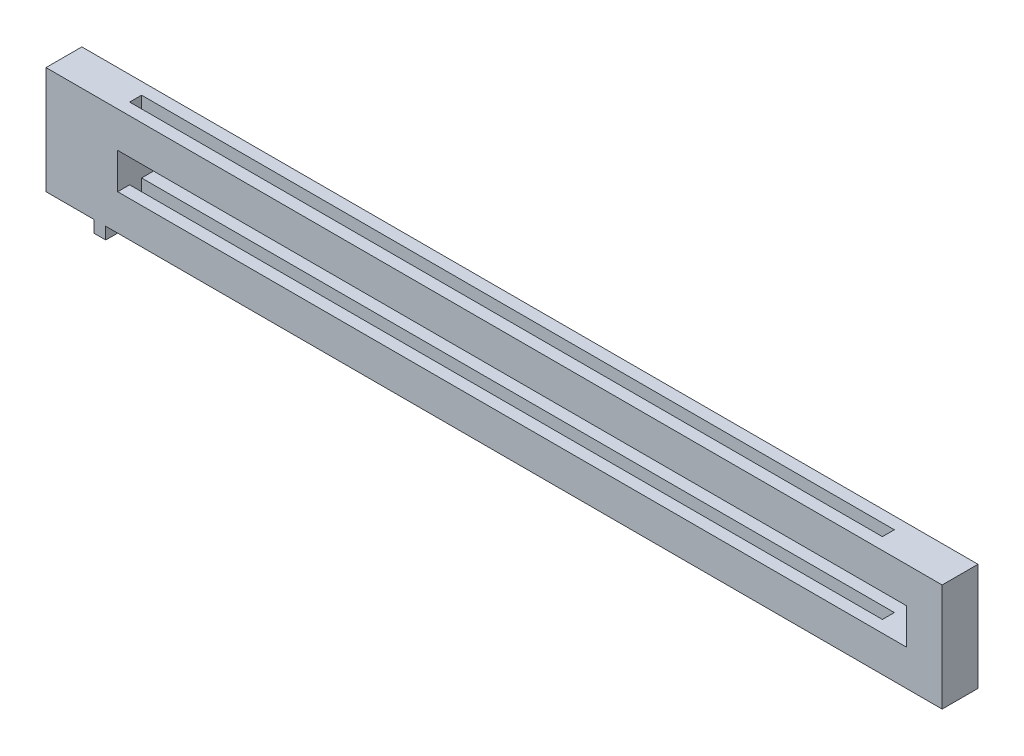
ISO-10303-21;
HEADER;
FILE_DESCRIPTION(('STEP AP214'),'2;1');
FILE_NAME('part.step','',(''),(''),'','','');
FILE_SCHEMA(('AUTOMOTIVE_DESIGN { 1 0 10303 214 1 1 1 1 }'));
ENDSEC;
DATA;
#1=APPLICATION_CONTEXT('core data for automotive mechanical design processes');
#2=APPLICATION_PROTOCOL_DEFINITION('international standard','automotive_design',2000,#1);
#3=PRODUCT_CONTEXT('',#1,'mechanical');
#4=PRODUCT('Part','Part','',(#3));
#5=PRODUCT_RELATED_PRODUCT_CATEGORY('part','',(#4));
#6=PRODUCT_DEFINITION_FORMATION('','',#4);
#7=PRODUCT_DEFINITION_CONTEXT('part definition',#1,'design');
#8=PRODUCT_DEFINITION('design','',#6,#7);
#9=PRODUCT_DEFINITION_SHAPE('','',#8);
#10=(LENGTH_UNIT() NAMED_UNIT(*) SI_UNIT(.MILLI.,.METRE.));
#11=(NAMED_UNIT(*) PLANE_ANGLE_UNIT() SI_UNIT($,.RADIAN.));
#12=(NAMED_UNIT(*) SI_UNIT($,.STERADIAN.) SOLID_ANGLE_UNIT());
#13=UNCERTAINTY_MEASURE_WITH_UNIT(LENGTH_MEASURE(1.E-05),#10,'distance_accuracy_value','');
#14=(GEOMETRIC_REPRESENTATION_CONTEXT(3) GLOBAL_UNCERTAINTY_ASSIGNED_CONTEXT((#13)) GLOBAL_UNIT_ASSIGNED_CONTEXT((#10,
#11,#12)) REPRESENTATION_CONTEXT('',''));
#15=CARTESIAN_POINT('',(0.,0.,0.));
#16=DIRECTION('',(0.,0.,1.));
#17=DIRECTION('',(1.,0.,0.));
#18=AXIS2_PLACEMENT_3D('',#15,#16,#17);
#19=CARTESIAN_POINT('',(-55.,-2.5,5.));
#20=DIRECTION('',(0.,1.,0.));
#21=DIRECTION('',(0.,0.,1.));
#22=AXIS2_PLACEMENT_3D('',#19,#20,#21);
#23=PLANE('',#22);
#24=DIRECTION('',(0.,0.,1.));
#25=VECTOR('',#24,1.);
#26=CARTESIAN_POINT('',(50.,-2.5,4.99999999999985));
#27=LINE('',#26,#25);
#28=CARTESIAN_POINT('',(50.,-2.5,1.66666666666667));
#29=VERTEX_POINT('',#28);
#30=CARTESIAN_POINT('',(50.,-2.5,3.33333333333332));
#31=VERTEX_POINT('',#30);
#32=EDGE_CURVE('E244',#29,#31,#27,.T.);
#33=ORIENTED_EDGE('',*,*,#32,.T.);
#34=DIRECTION('',(-1.,0.,0.));
#35=VECTOR('',#34,1.);
#36=CARTESIAN_POINT('',(-55.,-2.5,3.33333333333332));
#37=LINE('',#36,#35);
#38=CARTESIAN_POINT('',(-55.,-2.5,3.33333333333332));
#39=VERTEX_POINT('',#38);
#40=EDGE_CURVE('E248',#31,#39,#37,.T.);
#41=ORIENTED_EDGE('',*,*,#40,.T.);
#42=DIRECTION('',(0.,0.,-1.));
#43=VECTOR('',#42,1.);
#44=CARTESIAN_POINT('',(-55.,-2.5,5.));
#45=LINE('',#44,#43);
#46=CARTESIAN_POINT('',(-55.,-2.5,5.));
#47=VERTEX_POINT('',#46);
#48=EDGE_CURVE('E344',#47,#39,#45,.T.);
#49=ORIENTED_EDGE('',*,*,#48,.F.);
#50=DIRECTION('',(1.,0.,0.));
#51=VECTOR('',#50,1.);
#52=CARTESIAN_POINT('',(-55.,-2.5,5.));
#53=LINE('',#52,#51);
#54=CARTESIAN_POINT('',(55.,-2.5,5.));
#55=VERTEX_POINT('',#54);
#56=EDGE_CURVE('E308',#47,#55,#53,.T.);
#57=ORIENTED_EDGE('',*,*,#56,.T.);
#58=DIRECTION('',(0.,0.,-1.));
#59=VECTOR('',#58,1.);
#60=CARTESIAN_POINT('',(55.,-2.5,5.));
#61=LINE('',#60,#59);
#62=CARTESIAN_POINT('',(55.,-2.5,0.));
#63=VERTEX_POINT('',#62);
#64=EDGE_CURVE('E340',#55,#63,#61,.T.);
#65=ORIENTED_EDGE('',*,*,#64,.T.);
#66=DIRECTION('',(1.,0.,0.));
#67=VECTOR('',#66,1.);
#68=CARTESIAN_POINT('',(-55.,-2.5,0.));
#69=LINE('',#68,#67);
#70=CARTESIAN_POINT('',(-55.,-2.5,0.));
#71=VERTEX_POINT('',#70);
#72=EDGE_CURVE('E322',#71,#63,#69,.T.);
#73=ORIENTED_EDGE('',*,*,#72,.F.);
#74=CARTESIAN_POINT('',(-55.,-2.5,1.66666666666667));
#75=VERTEX_POINT('',#74);
#76=EDGE_CURVE('E343',#75,#71,#45,.T.);
#77=ORIENTED_EDGE('',*,*,#76,.F.);
#78=DIRECTION('',(-1.,0.,0.));
#79=VECTOR('',#78,1.);
#80=CARTESIAN_POINT('',(-55.,-2.5,1.66666666666667));
#81=LINE('',#80,#79);
#82=EDGE_CURVE('E233',#29,#75,#81,.T.);
#83=ORIENTED_EDGE('',*,*,#82,.F.);
#84=EDGE_LOOP('',(#33,#41,#49,#57,#65,#73,#77,#83));
#85=FACE_BOUND('',#84,.T.);
#86=ADVANCED_FACE('F46',(#85),#23,.T.);
#87=CARTESIAN_POINT('',(-55.,2.5,5.));
#88=DIRECTION('',(0.,-1.,0.));
#89=DIRECTION('',(0.,0.,-1.));
#90=AXIS2_PLACEMENT_3D('',#87,#88,#89);
#91=PLANE('',#90);
#92=DIRECTION('',(0.,0.,-1.));
#93=VECTOR('',#92,1.);
#94=CARTESIAN_POINT('',(-55.,2.5,5.));
#95=LINE('',#94,#93);
#96=CARTESIAN_POINT('',(-55.,2.5,5.));
#97=VERTEX_POINT('',#96);
#98=CARTESIAN_POINT('',(-55.,2.5,3.33333333333332));
#99=VERTEX_POINT('',#98);
#100=EDGE_CURVE('E333',#97,#99,#95,.T.);
#101=ORIENTED_EDGE('',*,*,#100,.T.);
#102=DIRECTION('',(1.,0.,0.));
#103=VECTOR('',#102,1.);
#104=CARTESIAN_POINT('',(-55.,2.5,3.33333333333332));
#105=LINE('',#104,#103);
#106=CARTESIAN_POINT('',(50.,2.5,3.33333333333332));
#107=VERTEX_POINT('',#106);
#108=EDGE_CURVE('E11',#99,#107,#105,.T.);
#109=ORIENTED_EDGE('',*,*,#108,.T.);
#110=DIRECTION('',(0.,0.,-1.));
#111=VECTOR('',#110,1.);
#112=CARTESIAN_POINT('',(50.,2.5,4.99999999999985));
#113=LINE('',#112,#111);
#114=CARTESIAN_POINT('',(50.,2.5,1.66666666666667));
#115=VERTEX_POINT('',#114);
#116=EDGE_CURVE('E55',#107,#115,#113,.T.);
#117=ORIENTED_EDGE('',*,*,#116,.T.);
#118=DIRECTION('',(1.,0.,0.));
#119=VECTOR('',#118,1.);
#120=CARTESIAN_POINT('',(-55.,2.5,1.66666666666667));
#121=LINE('',#120,#119);
#122=CARTESIAN_POINT('',(-55.,2.5,1.66666666666667));
#123=VERTEX_POINT('',#122);
#124=EDGE_CURVE('E377',#123,#115,#121,.T.);
#125=ORIENTED_EDGE('',*,*,#124,.F.);
#126=CARTESIAN_POINT('',(-55.,2.5,0.));
#127=VERTEX_POINT('',#126);
#128=EDGE_CURVE('E192',#123,#127,#95,.T.);
#129=ORIENTED_EDGE('',*,*,#128,.T.);
#130=DIRECTION('',(-1.,0.,0.));
#131=VECTOR('',#130,1.);
#132=CARTESIAN_POINT('',(-55.,2.5,0.));
#133=LINE('',#132,#131);
#134=CARTESIAN_POINT('',(55.,2.5,0.));
#135=VERTEX_POINT('',#134);
#136=EDGE_CURVE('E309',#135,#127,#133,.T.);
#137=ORIENTED_EDGE('',*,*,#136,.F.);
#138=DIRECTION('',(0.,0.,-1.));
#139=VECTOR('',#138,1.);
#140=CARTESIAN_POINT('',(55.,2.5,5.));
#141=LINE('',#140,#139);
#142=CARTESIAN_POINT('',(55.,2.5,5.));
#143=VERTEX_POINT('',#142);
#144=EDGE_CURVE('E337',#143,#135,#141,.T.);
#145=ORIENTED_EDGE('',*,*,#144,.F.);
#146=DIRECTION('',(-1.,0.,0.));
#147=VECTOR('',#146,1.);
#148=CARTESIAN_POINT('',(-55.,2.5,5.));
#149=LINE('',#148,#147);
#150=EDGE_CURVE('E316',#143,#97,#149,.T.);
#151=ORIENTED_EDGE('',*,*,#150,.T.);
#152=EDGE_LOOP('',(#101,#109,#117,#125,#129,#137,#145,#151));
#153=FACE_BOUND('',#152,.T.);
#154=ADVANCED_FACE('F382',(#153),#91,.T.);
#155=CARTESIAN_POINT('',(-60.,-7.5,5.));
#156=DIRECTION('',(0.,1.,0.));
#157=DIRECTION('',(0.,0.,1.));
#158=AXIS2_PLACEMENT_3D('',#155,#156,#157);
#159=PLANE('',#158);
#160=DIRECTION('',(0.,0.,-1.));
#161=VECTOR('',#160,1.);
#162=CARTESIAN_POINT('',(-58.3333333333333,-7.5,0.));
#163=LINE('',#162,#161);
#164=CARTESIAN_POINT('',(-58.3333333333333,-7.5,5.));
#165=VERTEX_POINT('',#164);
#166=CARTESIAN_POINT('',(-58.3333333333333,-7.5,0.));
#167=VERTEX_POINT('',#166);
#168=EDGE_CURVE('E274',#165,#167,#163,.T.);
#169=ORIENTED_EDGE('',*,*,#168,.F.);
#170=DIRECTION('',(1.,0.,0.));
#171=VECTOR('',#170,1.);
#172=CARTESIAN_POINT('',(-60.,-7.5,5.));
#173=LINE('',#172,#171);
#174=CARTESIAN_POINT('',(-65.,-7.5,5.));
#175=VERTEX_POINT('',#174);
#176=EDGE_CURVE('E349',#175,#165,#173,.T.);
#177=ORIENTED_EDGE('',*,*,#176,.F.);
#178=DIRECTION('',(0.,0.,1.));
#179=VECTOR('',#178,1.);
#180=CARTESIAN_POINT('',(-65.,-7.5,-15.8113883008419));
#181=LINE('',#180,#179);
#182=CARTESIAN_POINT('',(-65.,-7.5,0.));
#183=VERTEX_POINT('',#182);
#184=EDGE_CURVE('E258',#183,#175,#181,.T.);
#185=ORIENTED_EDGE('',*,*,#184,.F.);
#186=DIRECTION('',(1.,0.,0.));
#187=VECTOR('',#186,1.);
#188=CARTESIAN_POINT('',(-60.,-7.5,0.));
#189=LINE('',#188,#187);
#190=EDGE_CURVE('E361',#183,#167,#189,.T.);
#191=ORIENTED_EDGE('',*,*,#190,.T.);
#192=EDGE_LOOP('',(#169,#177,#185,#191));
#193=FACE_BOUND('',#192,.T.);
#194=ADVANCED_FACE('F421',(#193),#159,.F.);
#195=CARTESIAN_POINT('',(0.,0.,5.));
#196=DIRECTION('',(0.,0.,1.));
#197=DIRECTION('',(1.,0.,0.));
#198=AXIS2_PLACEMENT_3D('',#195,#196,#197);
#199=PLANE('',#198);
#200=DIRECTION('',(-1.,0.,0.));
#201=VECTOR('',#200,1.);
#202=CARTESIAN_POINT('',(-60.,7.5,5.));
#203=LINE('',#202,#201);
#204=CARTESIAN_POINT('',(60.,7.5,5.));
#205=VERTEX_POINT('',#204);
#206=CARTESIAN_POINT('',(-65.,7.5,5.));
#207=VERTEX_POINT('',#206);
#208=EDGE_CURVE('E357',#205,#207,#203,.T.);
#209=ORIENTED_EDGE('',*,*,#208,.T.);
#210=DIRECTION('',(0.,-1.,0.));
#211=VECTOR('',#210,1.);
#212=CARTESIAN_POINT('',(-65.,7.5,5.));
#213=LINE('',#212,#211);
#214=EDGE_CURVE('E252',#207,#175,#213,.T.);
#215=ORIENTED_EDGE('',*,*,#214,.T.);
#216=ORIENTED_EDGE('',*,*,#176,.T.);
#217=DIRECTION('',(0.,1.,0.));
#218=VECTOR('',#217,1.);
#219=CARTESIAN_POINT('',(-58.3333333333333,-9.16666666666667,5.));
#220=LINE('',#219,#218);
#221=CARTESIAN_POINT('',(-58.3333333333333,-9.16666666666667,5.));
#222=VERTEX_POINT('',#221);
#223=EDGE_CURVE('E296',#222,#165,#220,.T.);
#224=ORIENTED_EDGE('',*,*,#223,.F.);
#225=DIRECTION('',(-1.,0.,0.));
#226=VECTOR('',#225,1.);
#227=CARTESIAN_POINT('',(0.,-9.16666666666667,5.));
#228=LINE('',#227,#226);
#229=CARTESIAN_POINT('',(-56.6666666666667,-9.16666666666667,5.));
#230=VERTEX_POINT('',#229);
#231=EDGE_CURVE('E273',#230,#222,#228,.T.);
#232=ORIENTED_EDGE('',*,*,#231,.F.);
#233=DIRECTION('',(0.,1.,0.));
#234=VECTOR('',#233,1.);
#235=CARTESIAN_POINT('',(-56.6666666666667,-9.16666666666667,5.));
#236=LINE('',#235,#234);
#237=CARTESIAN_POINT('',(-56.6666666666667,-7.5,5.));
#238=VERTEX_POINT('',#237);
#239=EDGE_CURVE('E300',#230,#238,#236,.T.);
#240=ORIENTED_EDGE('',*,*,#239,.T.);
#241=CARTESIAN_POINT('',(60.,-7.5,5.));
#242=VERTEX_POINT('',#241);
#243=EDGE_CURVE('E354',#238,#242,#173,.T.);
#244=ORIENTED_EDGE('',*,*,#243,.T.);
#245=DIRECTION('',(0.,1.,0.));
#246=VECTOR('',#245,1.);
#247=CARTESIAN_POINT('',(60.,7.5,5.));
#248=LINE('',#247,#246);
#249=EDGE_CURVE('E353',#242,#205,#248,.T.);
#250=ORIENTED_EDGE('',*,*,#249,.T.);
#251=EDGE_LOOP('',(#209,#215,#216,#224,#232,#240,#244,#250));
#252=FACE_BOUND('',#251,.T.);
#253=ORIENTED_EDGE('',*,*,#56,.F.);
#254=DIRECTION('',(0.,-1.,0.));
#255=VECTOR('',#254,1.);
#256=CARTESIAN_POINT('',(-55.,2.5,5.));
#257=LINE('',#256,#255);
#258=EDGE_CURVE('E305',#97,#47,#257,.T.);
#259=ORIENTED_EDGE('',*,*,#258,.F.);
#260=ORIENTED_EDGE('',*,*,#150,.F.);
#261=DIRECTION('',(0.,1.,0.));
#262=VECTOR('',#261,1.);
#263=CARTESIAN_POINT('',(55.,2.5,5.));
#264=LINE('',#263,#262);
#265=EDGE_CURVE('E312',#55,#143,#264,.T.);
#266=ORIENTED_EDGE('',*,*,#265,.F.);
#267=EDGE_LOOP('',(#253,#259,#260,#266));
#268=FACE_BOUND('',#267,.T.);
#269=ADVANCED_FACE('F395',(#252,#268),#199,.T.);
#270=CARTESIAN_POINT('',(0.,0.,0.));
#271=DIRECTION('',(0.,0.,1.));
#272=DIRECTION('',(1.,0.,0.));
#273=AXIS2_PLACEMENT_3D('',#270,#271,#272);
#274=PLANE('',#273);
#275=ORIENTED_EDGE('',*,*,#190,.F.);
#276=DIRECTION('',(0.,1.,0.));
#277=VECTOR('',#276,1.);
#278=CARTESIAN_POINT('',(-65.,7.5,0.));
#279=LINE('',#278,#277);
#280=CARTESIAN_POINT('',(-65.,7.5,0.));
#281=VERTEX_POINT('',#280);
#282=EDGE_CURVE('E253',#183,#281,#279,.T.);
#283=ORIENTED_EDGE('',*,*,#282,.T.);
#284=DIRECTION('',(-1.,0.,0.));
#285=VECTOR('',#284,1.);
#286=CARTESIAN_POINT('',(-60.,7.5,0.));
#287=LINE('',#286,#285);
#288=CARTESIAN_POINT('',(60.,7.5,0.));
#289=VERTEX_POINT('',#288);
#290=EDGE_CURVE('E367',#289,#281,#287,.T.);
#291=ORIENTED_EDGE('',*,*,#290,.F.);
#292=DIRECTION('',(0.,1.,0.));
#293=VECTOR('',#292,1.);
#294=CARTESIAN_POINT('',(60.,7.5,0.));
#295=LINE('',#294,#293);
#296=CARTESIAN_POINT('',(60.,-7.5,0.));
#297=VERTEX_POINT('',#296);
#298=EDGE_CURVE('E364',#297,#289,#295,.T.);
#299=ORIENTED_EDGE('',*,*,#298,.F.);
#300=CARTESIAN_POINT('',(-56.6666666666667,-7.5,0.));
#301=VERTEX_POINT('',#300);
#302=EDGE_CURVE('E348',#301,#297,#189,.T.);
#303=ORIENTED_EDGE('',*,*,#302,.F.);
#304=DIRECTION('',(0.,1.,0.));
#305=VECTOR('',#304,1.);
#306=CARTESIAN_POINT('',(-56.6666666666667,-9.16666666666667,0.));
#307=LINE('',#306,#305);
#308=CARTESIAN_POINT('',(-56.6666666666667,-9.16666666666667,0.));
#309=VERTEX_POINT('',#308);
#310=EDGE_CURVE('E283',#309,#301,#307,.T.);
#311=ORIENTED_EDGE('',*,*,#310,.F.);
#312=DIRECTION('',(1.,0.,0.));
#313=VECTOR('',#312,1.);
#314=CARTESIAN_POINT('',(0.,-9.16666666666667,0.));
#315=LINE('',#314,#313);
#316=CARTESIAN_POINT('',(-58.3333333333333,-9.16666666666667,0.));
#317=VERTEX_POINT('',#316);
#318=EDGE_CURVE('E280',#317,#309,#315,.T.);
#319=ORIENTED_EDGE('',*,*,#318,.F.);
#320=DIRECTION('',(0.,1.,0.));
#321=VECTOR('',#320,1.);
#322=CARTESIAN_POINT('',(-58.3333333333333,-9.16666666666667,0.));
#323=LINE('',#322,#321);
#324=EDGE_CURVE('E292',#317,#167,#323,.T.);
#325=ORIENTED_EDGE('',*,*,#324,.T.);
#326=EDGE_LOOP('',(#275,#283,#291,#299,#303,#311,#319,#325));
#327=FACE_BOUND('',#326,.T.);
#328=DIRECTION('',(0.,-1.,0.));
#329=VECTOR('',#328,1.);
#330=CARTESIAN_POINT('',(-55.,2.5,0.));
#331=LINE('',#330,#329);
#332=EDGE_CURVE('E304',#127,#71,#331,.T.);
#333=ORIENTED_EDGE('',*,*,#332,.T.);
#334=ORIENTED_EDGE('',*,*,#72,.T.);
#335=DIRECTION('',(0.,1.,0.));
#336=VECTOR('',#335,1.);
#337=CARTESIAN_POINT('',(55.,2.5,0.));
#338=LINE('',#337,#336);
#339=EDGE_CURVE('E326',#63,#135,#338,.T.);
#340=ORIENTED_EDGE('',*,*,#339,.T.);
#341=ORIENTED_EDGE('',*,*,#136,.T.);
#342=EDGE_LOOP('',(#333,#334,#340,#341));
#343=FACE_BOUND('',#342,.T.);
#344=ADVANCED_FACE('F420',(#327,#343),#274,.F.);
#345=DIRECTION('',(1.,0.,0.));
#346=VECTOR('',#345,1.);
#347=CARTESIAN_POINT('',(0.,-7.5,1.66666666666667));
#348=LINE('',#347,#346);
#349=CARTESIAN_POINT('',(-55.,-7.5,1.66666666666667));
#350=VERTEX_POINT('',#349);
#351=CARTESIAN_POINT('',(50.,-7.5,1.66666666666667));
#352=VERTEX_POINT('',#351);
#353=EDGE_CURVE('E223',#350,#352,#348,.T.);
#354=ORIENTED_EDGE('',*,*,#353,.F.);
#355=DIRECTION('',(0.,0.,-1.));
#356=VECTOR('',#355,1.);
#357=CARTESIAN_POINT('',(-55.,-7.5,0.));
#358=LINE('',#357,#356);
#359=CARTESIAN_POINT('',(-55.,-7.5,3.33333333333332));
#360=VERTEX_POINT('',#359);
#361=EDGE_CURVE('E62',#360,#350,#358,.T.);
#362=ORIENTED_EDGE('',*,*,#361,.F.);
#363=DIRECTION('',(1.,0.,0.));
#364=VECTOR('',#363,1.);
#365=CARTESIAN_POINT('',(0.,-7.5,3.33333333333332));
#366=LINE('',#365,#364);
#367=CARTESIAN_POINT('',(50.,-7.5,3.33333333333332));
#368=VERTEX_POINT('',#367);
#369=EDGE_CURVE('E210',#360,#368,#366,.T.);
#370=ORIENTED_EDGE('',*,*,#369,.T.);
#371=DIRECTION('',(0.,0.,-1.));
#372=VECTOR('',#371,1.);
#373=CARTESIAN_POINT('',(50.,-7.5,0.));
#374=LINE('',#373,#372);
#375=EDGE_CURVE('E214',#368,#352,#374,.T.);
#376=ORIENTED_EDGE('',*,*,#375,.T.);
#377=EDGE_LOOP('',(#354,#362,#370,#376));
#378=FACE_BOUND('',#377,.T.);
#379=ORIENTED_EDGE('',*,*,#243,.F.);
#380=DIRECTION('',(0.,0.,-1.));
#381=VECTOR('',#380,1.);
#382=CARTESIAN_POINT('',(-56.6666666666667,-7.5,0.));
#383=LINE('',#382,#381);
#384=EDGE_CURVE('E257',#238,#301,#383,.T.);
#385=ORIENTED_EDGE('',*,*,#384,.T.);
#386=ORIENTED_EDGE('',*,*,#302,.T.);
#387=DIRECTION('',(0.,0.,-1.));
#388=VECTOR('',#387,1.);
#389=CARTESIAN_POINT('',(60.,-7.5,5.));
#390=LINE('',#389,#388);
#391=EDGE_CURVE('E373',#242,#297,#390,.T.);
#392=ORIENTED_EDGE('',*,*,#391,.F.);
#393=EDGE_LOOP('',(#379,#385,#386,#392));
#394=FACE_BOUND('',#393,.T.);
#395=ADVANCED_FACE('F48',(#378,#394),#159,.F.);
#396=CARTESIAN_POINT('',(60.,7.5,5.));
#397=DIRECTION('',(-1.,0.,0.));
#398=DIRECTION('',(0.,0.,1.));
#399=AXIS2_PLACEMENT_3D('',#396,#397,#398);
#400=PLANE('',#399);
#401=ORIENTED_EDGE('',*,*,#298,.T.);
#402=DIRECTION('',(0.,0.,-1.));
#403=VECTOR('',#402,1.);
#404=CARTESIAN_POINT('',(60.,7.5,5.));
#405=LINE('',#404,#403);
#406=EDGE_CURVE('E360',#205,#289,#405,.T.);
#407=ORIENTED_EDGE('',*,*,#406,.F.);
#408=ORIENTED_EDGE('',*,*,#249,.F.);
#409=ORIENTED_EDGE('',*,*,#391,.T.);
#410=EDGE_LOOP('',(#401,#407,#408,#409));
#411=FACE_BOUND('',#410,.T.);
#412=ADVANCED_FACE('F419',(#411),#400,.F.);
#413=CARTESIAN_POINT('',(-60.,7.5,5.));
#414=DIRECTION('',(0.,-1.,0.));
#415=DIRECTION('',(0.,0.,-1.));
#416=AXIS2_PLACEMENT_3D('',#413,#414,#415);
#417=PLANE('',#416);
#418=DIRECTION('',(1.,0.,0.));
#419=VECTOR('',#418,1.);
#420=CARTESIAN_POINT('',(0.,7.5,3.33333333333332));
#421=LINE('',#420,#419);
#422=CARTESIAN_POINT('',(-55.,7.5,3.33333333333332));
#423=VERTEX_POINT('',#422);
#424=CARTESIAN_POINT('',(50.,7.5,3.33333333333332));
#425=VERTEX_POINT('',#424);
#426=EDGE_CURVE('E208',#423,#425,#421,.T.);
#427=ORIENTED_EDGE('',*,*,#426,.F.);
#428=DIRECTION('',(0.,0.,-1.));
#429=VECTOR('',#428,1.);
#430=CARTESIAN_POINT('',(-55.,7.5,0.));
#431=LINE('',#430,#429);
#432=CARTESIAN_POINT('',(-55.,7.5,1.66666666666667));
#433=VERTEX_POINT('',#432);
#434=EDGE_CURVE('E189',#423,#433,#431,.T.);
#435=ORIENTED_EDGE('',*,*,#434,.T.);
#436=DIRECTION('',(1.,0.,0.));
#437=VECTOR('',#436,1.);
#438=CARTESIAN_POINT('',(0.,7.5,1.66666666666667));
#439=LINE('',#438,#437);
#440=CARTESIAN_POINT('',(50.,7.5,1.66666666666667));
#441=VERTEX_POINT('',#440);
#442=EDGE_CURVE('E199',#433,#441,#439,.T.);
#443=ORIENTED_EDGE('',*,*,#442,.T.);
#444=DIRECTION('',(0.,0.,-1.));
#445=VECTOR('',#444,1.);
#446=CARTESIAN_POINT('',(50.,7.5,0.));
#447=LINE('',#446,#445);
#448=EDGE_CURVE('E204',#425,#441,#447,.T.);
#449=ORIENTED_EDGE('',*,*,#448,.F.);
#450=EDGE_LOOP('',(#427,#435,#443,#449));
#451=FACE_BOUND('',#450,.T.);
#452=ORIENTED_EDGE('',*,*,#290,.T.);
#453=DIRECTION('',(0.,0.,1.));
#454=VECTOR('',#453,1.);
#455=CARTESIAN_POINT('',(-65.,7.5,-15.8113883008419));
#456=LINE('',#455,#454);
#457=EDGE_CURVE('E262',#281,#207,#456,.T.);
#458=ORIENTED_EDGE('',*,*,#457,.T.);
#459=ORIENTED_EDGE('',*,*,#208,.F.);
#460=ORIENTED_EDGE('',*,*,#406,.T.);
#461=EDGE_LOOP('',(#452,#458,#459,#460));
#462=FACE_BOUND('',#461,.T.);
#463=ADVANCED_FACE('F206',(#451,#462),#417,.F.);
#464=CARTESIAN_POINT('',(-55.,2.5,5.));
#465=DIRECTION('',(1.,0.,0.));
#466=DIRECTION('',(0.,0.,-1.));
#467=AXIS2_PLACEMENT_3D('',#464,#465,#466);
#468=PLANE('',#467);
#469=ORIENTED_EDGE('',*,*,#128,.F.);
#470=DIRECTION('',(0.,-1.,0.));
#471=VECTOR('',#470,1.);
#472=CARTESIAN_POINT('',(-55.,7.5,1.66666666666667));
#473=LINE('',#472,#471);
#474=EDGE_CURVE('E185',#433,#123,#473,.T.);
#475=ORIENTED_EDGE('',*,*,#474,.F.);
#476=ORIENTED_EDGE('',*,*,#434,.F.);
#477=DIRECTION('',(0.,-1.,0.));
#478=VECTOR('',#477,1.);
#479=CARTESIAN_POINT('',(-55.,7.5,3.33333333333332));
#480=LINE('',#479,#478);
#481=EDGE_CURVE('E230',#423,#99,#480,.T.);
#482=ORIENTED_EDGE('',*,*,#481,.T.);
#483=ORIENTED_EDGE('',*,*,#100,.F.);
#484=ORIENTED_EDGE('',*,*,#258,.T.);
#485=ORIENTED_EDGE('',*,*,#48,.T.);
#486=EDGE_CURVE('E234',#39,#360,#480,.T.);
#487=ORIENTED_EDGE('',*,*,#486,.T.);
#488=ORIENTED_EDGE('',*,*,#361,.T.);
#489=EDGE_CURVE('E196',#75,#350,#473,.T.);
#490=ORIENTED_EDGE('',*,*,#489,.F.);
#491=ORIENTED_EDGE('',*,*,#76,.T.);
#492=ORIENTED_EDGE('',*,*,#332,.F.);
#493=EDGE_LOOP('',(#469,#475,#476,#482,#483,#484,#485,#487,#488,#490,#491,#492));
#494=FACE_BOUND('',#493,.T.);
#495=ADVANCED_FACE('F186',(#494),#468,.T.);
#496=CARTESIAN_POINT('',(55.,2.5,5.));
#497=DIRECTION('',(-1.,0.,0.));
#498=DIRECTION('',(0.,0.,1.));
#499=AXIS2_PLACEMENT_3D('',#496,#497,#498);
#500=PLANE('',#499);
#501=ORIENTED_EDGE('',*,*,#339,.F.);
#502=ORIENTED_EDGE('',*,*,#64,.F.);
#503=ORIENTED_EDGE('',*,*,#265,.T.);
#504=ORIENTED_EDGE('',*,*,#144,.T.);
#505=EDGE_LOOP('',(#501,#502,#503,#504));
#506=FACE_BOUND('',#505,.T.);
#507=ADVANCED_FACE('F445',(#506),#500,.T.);
#508=CARTESIAN_POINT('',(-56.6666666666667,-9.16666666666667,0.));
#509=DIRECTION('',(1.,0.,0.));
#510=DIRECTION('',(0.,0.,-1.));
#511=AXIS2_PLACEMENT_3D('',#508,#509,#510);
#512=PLANE('',#511);
#513=ORIENTED_EDGE('',*,*,#384,.F.);
#514=ORIENTED_EDGE('',*,*,#239,.F.);
#515=DIRECTION('',(0.,0.,-1.));
#516=VECTOR('',#515,1.);
#517=CARTESIAN_POINT('',(-56.6666666666667,-9.16666666666667,0.));
#518=LINE('',#517,#516);
#519=EDGE_CURVE('E269',#230,#309,#518,.T.);
#520=ORIENTED_EDGE('',*,*,#519,.T.);
#521=ORIENTED_EDGE('',*,*,#310,.T.);
#522=EDGE_LOOP('',(#513,#514,#520,#521));
#523=FACE_BOUND('',#522,.T.);
#524=ADVANCED_FACE('F432',(#523),#512,.T.);
#525=CARTESIAN_POINT('',(-58.3333333333333,-9.16666666666667,0.));
#526=DIRECTION('',(1.,0.,0.));
#527=DIRECTION('',(0.,0.,-1.));
#528=AXIS2_PLACEMENT_3D('',#525,#526,#527);
#529=PLANE('',#528);
#530=ORIENTED_EDGE('',*,*,#168,.T.);
#531=ORIENTED_EDGE('',*,*,#324,.F.);
#532=DIRECTION('',(0.,0.,-1.));
#533=VECTOR('',#532,1.);
#534=CARTESIAN_POINT('',(-58.3333333333333,-9.16666666666667,0.));
#535=LINE('',#534,#533);
#536=EDGE_CURVE('E277',#222,#317,#535,.T.);
#537=ORIENTED_EDGE('',*,*,#536,.F.);
#538=ORIENTED_EDGE('',*,*,#223,.T.);
#539=EDGE_LOOP('',(#530,#531,#537,#538));
#540=FACE_BOUND('',#539,.T.);
#541=ADVANCED_FACE('F452',(#540),#529,.F.);
#542=CARTESIAN_POINT('',(0.,-9.16666666666667,0.));
#543=DIRECTION('',(0.,-1.,0.));
#544=DIRECTION('',(0.,0.,-1.));
#545=AXIS2_PLACEMENT_3D('',#542,#543,#544);
#546=PLANE('',#545);
#547=ORIENTED_EDGE('',*,*,#519,.F.);
#548=ORIENTED_EDGE('',*,*,#231,.T.);
#549=ORIENTED_EDGE('',*,*,#536,.T.);
#550=ORIENTED_EDGE('',*,*,#318,.T.);
#551=EDGE_LOOP('',(#547,#548,#549,#550));
#552=FACE_BOUND('',#551,.T.);
#553=ADVANCED_FACE('F485',(#552),#546,.T.);
#554=CARTESIAN_POINT('',(-65.,7.5,-15.8113883008419));
#555=DIRECTION('',(-1.,0.,0.));
#556=DIRECTION('',(0.,0.,1.));
#557=AXIS2_PLACEMENT_3D('',#554,#555,#556);
#558=PLANE('',#557);
#559=ORIENTED_EDGE('',*,*,#282,.F.);
#560=ORIENTED_EDGE('',*,*,#184,.T.);
#561=ORIENTED_EDGE('',*,*,#214,.F.);
#562=ORIENTED_EDGE('',*,*,#457,.F.);
#563=EDGE_LOOP('',(#559,#560,#561,#562));
#564=FACE_BOUND('',#563,.T.);
#565=ADVANCED_FACE('F479',(#564),#558,.T.);
#566=CARTESIAN_POINT('',(0.,7.5,1.66666666666667));
#567=DIRECTION('',(0.,0.,-1.));
#568=DIRECTION('',(-1.,0.,0.));
#569=AXIS2_PLACEMENT_3D('',#566,#567,#568);
#570=PLANE('',#569);
#571=ORIENTED_EDGE('',*,*,#124,.T.);
#572=DIRECTION('',(0.,-1.,0.));
#573=VECTOR('',#572,1.);
#574=CARTESIAN_POINT('',(50.,7.5,1.66666666666667));
#575=LINE('',#574,#573);
#576=EDGE_CURVE('E70',#441,#115,#575,.T.);
#577=ORIENTED_EDGE('',*,*,#576,.F.);
#578=ORIENTED_EDGE('',*,*,#442,.F.);
#579=ORIENTED_EDGE('',*,*,#474,.T.);
#580=EDGE_LOOP('',(#571,#577,#578,#579));
#581=FACE_BOUND('',#580,.T.);
#582=ADVANCED_FACE('F200',(#581),#570,.F.);
#583=CARTESIAN_POINT('',(50.,7.5,0.));
#584=DIRECTION('',(-1.,0.,0.));
#585=DIRECTION('',(0.,0.,1.));
#586=AXIS2_PLACEMENT_3D('',#583,#584,#585);
#587=PLANE('',#586);
#588=DIRECTION('',(0.,-1.,0.));
#589=VECTOR('',#588,1.);
#590=CARTESIAN_POINT('',(50.,7.5,3.33333333333332));
#591=LINE('',#590,#589);
#592=EDGE_CURVE('E235',#425,#107,#591,.T.);
#593=ORIENTED_EDGE('',*,*,#592,.F.);
#594=ORIENTED_EDGE('',*,*,#448,.T.);
#595=ORIENTED_EDGE('',*,*,#576,.T.);
#596=ORIENTED_EDGE('',*,*,#116,.F.);
#597=EDGE_LOOP('',(#593,#594,#595,#596));
#598=FACE_BOUND('',#597,.T.);
#599=ADVANCED_FACE('F385',(#598),#587,.T.);
#600=CARTESIAN_POINT('',(0.,7.5,3.33333333333332));
#601=DIRECTION('',(0.,0.,-1.));
#602=DIRECTION('',(-1.,0.,0.));
#603=AXIS2_PLACEMENT_3D('',#600,#601,#602);
#604=PLANE('',#603);
#605=ORIENTED_EDGE('',*,*,#481,.F.);
#606=ORIENTED_EDGE('',*,*,#426,.T.);
#607=ORIENTED_EDGE('',*,*,#592,.T.);
#608=ORIENTED_EDGE('',*,*,#108,.F.);
#609=EDGE_LOOP('',(#605,#606,#607,#608));
#610=FACE_BOUND('',#609,.T.);
#611=ADVANCED_FACE('F387',(#610),#604,.T.);
#612=EDGE_CURVE('E239',#31,#368,#591,.T.);
#613=ORIENTED_EDGE('',*,*,#612,.T.);
#614=ORIENTED_EDGE('',*,*,#369,.F.);
#615=ORIENTED_EDGE('',*,*,#486,.F.);
#616=ORIENTED_EDGE('',*,*,#40,.F.);
#617=EDGE_LOOP('',(#613,#614,#615,#616));
#618=FACE_BOUND('',#617,.T.);
#619=ADVANCED_FACE('F403',(#618),#604,.T.);
#620=EDGE_CURVE('E195',#29,#352,#575,.T.);
#621=ORIENTED_EDGE('',*,*,#620,.T.);
#622=ORIENTED_EDGE('',*,*,#375,.F.);
#623=ORIENTED_EDGE('',*,*,#612,.F.);
#624=ORIENTED_EDGE('',*,*,#32,.F.);
#625=EDGE_LOOP('',(#621,#622,#623,#624));
#626=FACE_BOUND('',#625,.T.);
#627=ADVANCED_FACE('F407',(#626),#587,.T.);
#628=ORIENTED_EDGE('',*,*,#82,.T.);
#629=ORIENTED_EDGE('',*,*,#489,.T.);
#630=ORIENTED_EDGE('',*,*,#353,.T.);
#631=ORIENTED_EDGE('',*,*,#620,.F.);
#632=EDGE_LOOP('',(#628,#629,#630,#631));
#633=FACE_BOUND('',#632,.T.);
#634=ADVANCED_FACE('F414',(#633),#570,.F.);
#635=CLOSED_SHELL('',(#86,#154,#194,#269,#344,#395,#412,#463,#495,#507,#524,#541,#553,#565,#582,
#599,#611,#619,#627,#634));
#636=MANIFOLD_SOLID_BREP('B2',#635);
#637=ADVANCED_BREP_SHAPE_REPRESENTATION('',(#18,#636),#14);
#638=SHAPE_DEFINITION_REPRESENTATION(#9,#637);
ENDSEC;
END-ISO-10303-21;
